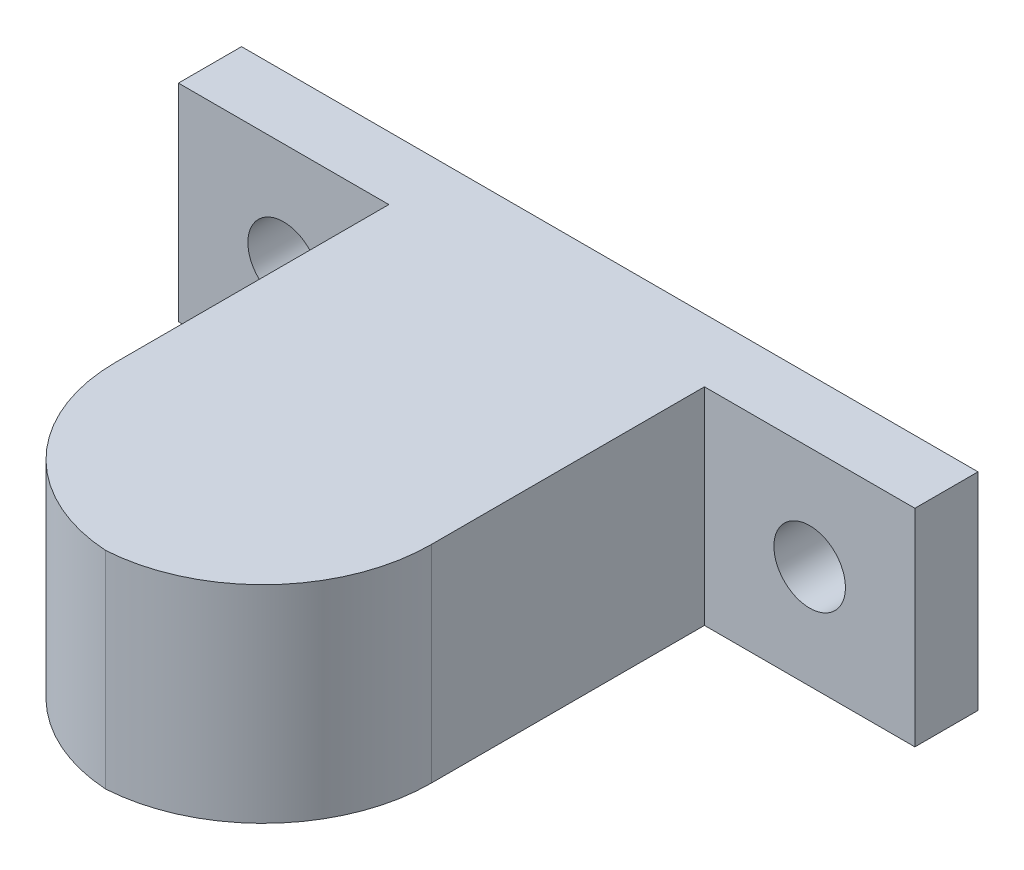
ISO-10303-21;
HEADER;
FILE_DESCRIPTION(('STEP AP214'),'2;1');
FILE_NAME('part.step','',(''),(''),'','','');
FILE_SCHEMA(('AUTOMOTIVE_DESIGN { 1 0 10303 214 1 1 1 1 }'));
ENDSEC;
DATA;
#1=APPLICATION_CONTEXT('core data for automotive mechanical design processes');
#2=APPLICATION_PROTOCOL_DEFINITION('international standard','automotive_design',2000,#1);
#3=PRODUCT_CONTEXT('',#1,'mechanical');
#4=PRODUCT('Part','Part','',(#3));
#5=PRODUCT_RELATED_PRODUCT_CATEGORY('part','',(#4));
#6=PRODUCT_DEFINITION_FORMATION('','',#4);
#7=PRODUCT_DEFINITION_CONTEXT('part definition',#1,'design');
#8=PRODUCT_DEFINITION('design','',#6,#7);
#9=PRODUCT_DEFINITION_SHAPE('','',#8);
#10=(LENGTH_UNIT() NAMED_UNIT(*) SI_UNIT(.MILLI.,.METRE.));
#11=(NAMED_UNIT(*) PLANE_ANGLE_UNIT() SI_UNIT($,.RADIAN.));
#12=(NAMED_UNIT(*) SI_UNIT($,.STERADIAN.) SOLID_ANGLE_UNIT());
#13=UNCERTAINTY_MEASURE_WITH_UNIT(LENGTH_MEASURE(1.E-05),#10,'distance_accuracy_value','');
#14=(GEOMETRIC_REPRESENTATION_CONTEXT(3) GLOBAL_UNCERTAINTY_ASSIGNED_CONTEXT((#13)) GLOBAL_UNIT_ASSIGNED_CONTEXT((#10,
#11,#12)) REPRESENTATION_CONTEXT('',''));
#15=CARTESIAN_POINT('',(0.,0.,0.));
#16=DIRECTION('',(0.,0.,1.));
#17=DIRECTION('',(1.,0.,0.));
#18=AXIS2_PLACEMENT_3D('',#15,#16,#17);
#19=CARTESIAN_POINT('',(0.,0.,3.));
#20=DIRECTION('',(0.,0.,1.));
#21=DIRECTION('',(1.,0.,0.));
#22=AXIS2_PLACEMENT_3D('',#19,#20,#21);
#23=PLANE('',#22);
#24=CARTESIAN_POINT('',(-241.349999999714,299.7113560134,3.));
#25=DIRECTION('',(0.,0.,1.));
#26=DIRECTION('',(1.,0.,0.));
#27=AXIS2_PLACEMENT_3D('',#24,#25,#26);
#28=CIRCLE('',#27,1.70000000000001);
#29=CARTESIAN_POINT('',(-239.649999999714,299.7113560134,3.));
#30=VERTEX_POINT('',#29);
#31=EDGE_CURVE('E163',#30,#30,#28,.T.);
#32=ORIENTED_EDGE('',*,*,#31,.F.);
#33=EDGE_LOOP('',(#32));
#34=FACE_BOUND('',#33,.T.);
#35=DIRECTION('',(1.,0.,0.));
#36=VECTOR('',#35,1.);
#37=CARTESIAN_POINT('',(0.,304.622712026794,3.));
#38=LINE('',#37,#36);
#39=CARTESIAN_POINT('',(-246.349999999708,304.622712026794,3.));
#40=VERTEX_POINT('',#39);
#41=CARTESIAN_POINT('',(-236.349999999714,304.622712026794,3.));
#42=VERTEX_POINT('',#41);
#43=EDGE_CURVE('E125',#40,#42,#38,.T.);
#44=ORIENTED_EDGE('',*,*,#43,.F.);
#45=DIRECTION('',(0.,-1.,0.));
#46=VECTOR('',#45,1.);
#47=CARTESIAN_POINT('',(-246.349999999708,0.,3.));
#48=LINE('',#47,#46);
#49=CARTESIAN_POINT('',(-246.349999999708,294.799999999998,3.));
#50=VERTEX_POINT('',#49);
#51=EDGE_CURVE('E107',#40,#50,#48,.T.);
#52=ORIENTED_EDGE('',*,*,#51,.T.);
#53=DIRECTION('',(1.,0.,0.));
#54=VECTOR('',#53,1.);
#55=CARTESIAN_POINT('',(1.95691328952886E-12,294.799999999996,3.));
#56=LINE('',#55,#54);
#57=CARTESIAN_POINT('',(-236.349999999714,294.799999999998,3.));
#58=VERTEX_POINT('',#57);
#59=EDGE_CURVE('E115',#50,#58,#56,.T.);
#60=ORIENTED_EDGE('',*,*,#59,.T.);
#61=DIRECTION('',(0.,-1.,0.));
#62=VECTOR('',#61,1.);
#63=CARTESIAN_POINT('',(-236.349999999714,0.,3.));
#64=LINE('',#63,#62);
#65=EDGE_CURVE('E170',#42,#58,#64,.T.);
#66=ORIENTED_EDGE('',*,*,#65,.F.);
#67=EDGE_LOOP('',(#44,#52,#60,#66));
#68=FACE_BOUND('',#67,.T.);
#69=ADVANCED_FACE('F34',(#34,#68),#23,.T.);
#70=CARTESIAN_POINT('',(-236.349999999714,0.,3.));
#71=DIRECTION('',(1.,0.,0.));
#72=DIRECTION('',(0.,0.,-1.));
#73=AXIS2_PLACEMENT_3D('',#70,#71,#72);
#74=PLANE('',#73);
#75=DIRECTION('',(0.,-1.,0.));
#76=VECTOR('',#75,1.);
#77=CARTESIAN_POINT('',(-236.349999999714,0.,0.));
#78=LINE('',#77,#76);
#79=CARTESIAN_POINT('',(-236.349999999714,304.622712026794,0.));
#80=VERTEX_POINT('',#79);
#81=CARTESIAN_POINT('',(-236.349999999714,294.799999999998,0.));
#82=VERTEX_POINT('',#81);
#83=EDGE_CURVE('E183',#80,#82,#78,.T.);
#84=ORIENTED_EDGE('',*,*,#83,.F.);
#85=DIRECTION('',(0.,0.,-1.));
#86=VECTOR('',#85,1.);
#87=CARTESIAN_POINT('',(-236.349999999714,304.622712026794,3.));
#88=LINE('',#87,#86);
#89=EDGE_CURVE('E132',#42,#80,#88,.T.);
#90=ORIENTED_EDGE('',*,*,#89,.F.);
#91=ORIENTED_EDGE('',*,*,#65,.T.);
#92=DIRECTION('',(0.,0.,-1.));
#93=VECTOR('',#92,1.);
#94=CARTESIAN_POINT('',(-236.349999999714,294.799999999998,3.));
#95=LINE('',#94,#93);
#96=EDGE_CURVE('E118',#58,#82,#95,.T.);
#97=ORIENTED_EDGE('',*,*,#96,.T.);
#98=EDGE_LOOP('',(#84,#90,#91,#97));
#99=FACE_BOUND('',#98,.T.);
#100=ADVANCED_FACE('F202',(#99),#74,.T.);
#101=CARTESIAN_POINT('',(0.,304.622712026794,3.));
#102=DIRECTION('',(0.,1.,0.));
#103=DIRECTION('',(0.,0.,1.));
#104=AXIS2_PLACEMENT_3D('',#101,#102,#103);
#105=PLANE('',#104);
#106=CARTESIAN_POINT('',(-253.349999999708,304.622712026794,15.9809171334721));
#107=DIRECTION('',(0.,1.,0.));
#108=DIRECTION('',(0.,0.,1.));
#109=AXIS2_PLACEMENT_3D('',#106,#107,#108);
#110=CIRCLE('',#109,8.);
#111=CARTESIAN_POINT('',(-261.349999999708,304.622712026794,15.9809171334721));
#112=VERTEX_POINT('',#111);
#113=CARTESIAN_POINT('',(-253.849999999708,304.622712026794,23.9652768448077));
#114=VERTEX_POINT('',#113);
#115=EDGE_CURVE('E126',#112,#114,#110,.T.);
#116=ORIENTED_EDGE('',*,*,#115,.T.);
#117=CARTESIAN_POINT('',(-254.349999999708,304.622712026794,15.9809171334721));
#118=DIRECTION('',(0.,1.,0.));
#119=DIRECTION('',(0.,0.,1.));
#120=AXIS2_PLACEMENT_3D('',#117,#118,#119);
#121=CIRCLE('',#120,8.);
#122=CARTESIAN_POINT('',(-246.349999999708,304.622712026794,15.9809171334721));
#123=VERTEX_POINT('',#122);
#124=EDGE_CURVE('E129',#114,#123,#121,.T.);
#125=ORIENTED_EDGE('',*,*,#124,.T.);
#126=DIRECTION('',(0.,0.,1.));
#127=VECTOR('',#126,1.);
#128=CARTESIAN_POINT('',(-246.349999999708,304.622712026794,2.83341350286048));
#129=LINE('',#128,#127);
#130=EDGE_CURVE('E142',#40,#123,#129,.T.);
#131=ORIENTED_EDGE('',*,*,#130,.F.);
#132=ORIENTED_EDGE('',*,*,#43,.T.);
#133=ORIENTED_EDGE('',*,*,#89,.T.);
#134=DIRECTION('',(1.,0.,0.));
#135=VECTOR('',#134,1.);
#136=CARTESIAN_POINT('',(0.,304.622712026794,0.));
#137=LINE('',#136,#135);
#138=CARTESIAN_POINT('',(-271.349999999715,304.622712026794,0.));
#139=VERTEX_POINT('',#138);
#140=EDGE_CURVE('E186',#139,#80,#137,.T.);
#141=ORIENTED_EDGE('',*,*,#140,.F.);
#142=DIRECTION('',(0.,0.,-1.));
#143=VECTOR('',#142,1.);
#144=CARTESIAN_POINT('',(-271.349999999715,304.622712026794,3.));
#145=LINE('',#144,#143);
#146=CARTESIAN_POINT('',(-271.349999999715,304.622712026794,3.));
#147=VERTEX_POINT('',#146);
#148=EDGE_CURVE('E197',#147,#139,#145,.T.);
#149=ORIENTED_EDGE('',*,*,#148,.F.);
#150=CARTESIAN_POINT('',(-261.349999999708,304.622712026794,3.));
#151=VERTEX_POINT('',#150);
#152=EDGE_CURVE('E172',#147,#151,#38,.T.);
#153=ORIENTED_EDGE('',*,*,#152,.T.);
#154=DIRECTION('',(0.,0.,1.));
#155=VECTOR('',#154,1.);
#156=CARTESIAN_POINT('',(-261.349999999708,304.622712026794,2.83341350286048));
#157=LINE('',#156,#155);
#158=EDGE_CURVE('E112',#151,#112,#157,.T.);
#159=ORIENTED_EDGE('',*,*,#158,.T.);
#160=EDGE_LOOP('',(#116,#125,#131,#132,#133,#141,#149,#153,#159));
#161=FACE_BOUND('',#160,.T.);
#162=ADVANCED_FACE('F141',(#161),#105,.T.);
#163=CARTESIAN_POINT('',(-271.349999999713,-1.5334818780693E-12,3.));
#164=DIRECTION('',(1.,0.,0.));
#165=DIRECTION('',(0.,1.,0.));
#166=AXIS2_PLACEMENT_3D('',#163,#164,#165);
#167=PLANE('',#166);
#168=DIRECTION('',(0.,-1.,0.));
#169=VECTOR('',#168,1.);
#170=CARTESIAN_POINT('',(-271.349999999713,-1.5334818780693E-12,0.));
#171=LINE('',#170,#169);
#172=CARTESIAN_POINT('',(-271.349999999714,294.799999999998,0.));
#173=VERTEX_POINT('',#172);
#174=EDGE_CURVE('E189',#139,#173,#171,.T.);
#175=ORIENTED_EDGE('',*,*,#174,.T.);
#176=DIRECTION('',(0.,0.,-1.));
#177=VECTOR('',#176,1.);
#178=CARTESIAN_POINT('',(-271.349999999714,294.799999999998,3.));
#179=LINE('',#178,#177);
#180=CARTESIAN_POINT('',(-271.349999999714,294.799999999998,3.));
#181=VERTEX_POINT('',#180);
#182=EDGE_CURVE('E194',#181,#173,#179,.T.);
#183=ORIENTED_EDGE('',*,*,#182,.F.);
#184=DIRECTION('',(0.,-1.,0.));
#185=VECTOR('',#184,1.);
#186=CARTESIAN_POINT('',(-271.349999999713,-1.5334818780693E-12,3.));
#187=LINE('',#186,#185);
#188=EDGE_CURVE('E123',#147,#181,#187,.T.);
#189=ORIENTED_EDGE('',*,*,#188,.F.);
#190=ORIENTED_EDGE('',*,*,#148,.T.);
#191=EDGE_LOOP('',(#175,#183,#189,#190));
#192=FACE_BOUND('',#191,.T.);
#193=ADVANCED_FACE('F208',(#192),#167,.F.);
#194=CARTESIAN_POINT('',(-266.349999999714,299.7113560134,3.));
#195=DIRECTION('',(0.,0.,-1.));
#196=DIRECTION('',(-1.,0.,0.));
#197=AXIS2_PLACEMENT_3D('',#194,#195,#196);
#198=CYLINDRICAL_SURFACE('',#197,1.69999999999995);
#199=CARTESIAN_POINT('',(-266.349999999714,299.7113560134,3.));
#200=DIRECTION('',(0.,0.,1.));
#201=DIRECTION('',(1.,0.,0.));
#202=AXIS2_PLACEMENT_3D('',#199,#200,#201);
#203=CIRCLE('',#202,1.69999999999995);
#204=CARTESIAN_POINT('',(-264.649999999715,299.7113560134,3.));
#205=VERTEX_POINT('',#204);
#206=EDGE_CURVE('E166',#205,#205,#203,.T.);
#207=ORIENTED_EDGE('',*,*,#206,.T.);
#208=EDGE_LOOP('',(#207));
#209=FACE_BOUND('',#208,.T.);
#210=CARTESIAN_POINT('',(-266.349999999714,299.7113560134,0.));
#211=DIRECTION('',(0.,0.,1.));
#212=DIRECTION('',(1.,0.,0.));
#213=AXIS2_PLACEMENT_3D('',#210,#211,#212);
#214=CIRCLE('',#213,1.69999999999995);
#215=CARTESIAN_POINT('',(-264.649999999715,299.7113560134,0.));
#216=VERTEX_POINT('',#215);
#217=EDGE_CURVE('E180',#216,#216,#214,.T.);
#218=ORIENTED_EDGE('',*,*,#217,.F.);
#219=EDGE_LOOP('',(#218));
#220=FACE_BOUND('',#219,.T.);
#221=ADVANCED_FACE('F246',(#209,#220),#198,.F.);
#222=CARTESIAN_POINT('',(-241.349999999714,299.7113560134,3.));
#223=DIRECTION('',(0.,0.,-1.));
#224=DIRECTION('',(-1.,0.,0.));
#225=AXIS2_PLACEMENT_3D('',#222,#223,#224);
#226=CYLINDRICAL_SURFACE('',#225,1.70000000000001);
#227=ORIENTED_EDGE('',*,*,#31,.T.);
#228=EDGE_LOOP('',(#227));
#229=FACE_BOUND('',#228,.T.);
#230=CARTESIAN_POINT('',(-241.349999999714,299.7113560134,0.));
#231=DIRECTION('',(0.,0.,1.));
#232=DIRECTION('',(1.,0.,0.));
#233=AXIS2_PLACEMENT_3D('',#230,#231,#232);
#234=CIRCLE('',#233,1.70000000000001);
#235=CARTESIAN_POINT('',(-239.649999999714,299.7113560134,0.));
#236=VERTEX_POINT('',#235);
#237=EDGE_CURVE('E160',#236,#236,#234,.T.);
#238=ORIENTED_EDGE('',*,*,#237,.F.);
#239=EDGE_LOOP('',(#238));
#240=FACE_BOUND('',#239,.T.);
#241=ADVANCED_FACE('F240',(#229,#240),#226,.F.);
#242=CARTESIAN_POINT('',(1.95691328952886E-12,294.799999999996,3.));
#243=DIRECTION('',(0.,1.,0.));
#244=DIRECTION('',(-1.,0.,0.));
#245=AXIS2_PLACEMENT_3D('',#242,#243,#244);
#246=PLANE('',#245);
#247=CARTESIAN_POINT('',(-253.849999999708,294.799999999998,16.5));
#248=DIRECTION('',(0.,-1.,0.));
#249=DIRECTION('',(1.,0.,0.));
#250=AXIS2_PLACEMENT_3D('',#247,#248,#249);
#251=CIRCLE('',#250,4.10000000000001);
#252=CARTESIAN_POINT('',(-249.749999999708,294.799999999998,16.5));
#253=VERTEX_POINT('',#252);
#254=EDGE_CURVE('E153',#253,#253,#251,.T.);
#255=ORIENTED_EDGE('',*,*,#254,.F.);
#256=EDGE_LOOP('',(#255));
#257=FACE_BOUND('',#256,.T.);
#258=DIRECTION('',(0.,0.,-1.));
#259=VECTOR('',#258,1.);
#260=CARTESIAN_POINT('',(-246.349999999708,294.799999999998,2.83341350286048));
#261=LINE('',#260,#259);
#262=CARTESIAN_POINT('',(-246.349999999708,294.799999999998,15.9809171334721));
#263=VERTEX_POINT('',#262);
#264=EDGE_CURVE('E102',#263,#50,#261,.T.);
#265=ORIENTED_EDGE('',*,*,#264,.F.);
#266=CARTESIAN_POINT('',(-254.349999999708,294.799999999998,15.9809171334721));
#267=DIRECTION('',(0.,1.,0.));
#268=DIRECTION('',(-1.,0.,0.));
#269=AXIS2_PLACEMENT_3D('',#266,#267,#268);
#270=CIRCLE('',#269,8.);
#271=CARTESIAN_POINT('',(-253.849999999708,294.799999999998,23.9652768448077));
#272=VERTEX_POINT('',#271);
#273=EDGE_CURVE('E43',#263,#272,#270,.F.);
#274=ORIENTED_EDGE('',*,*,#273,.T.);
#275=CARTESIAN_POINT('',(-253.349999999708,294.799999999998,15.9809171334721));
#276=DIRECTION('',(0.,1.,0.));
#277=DIRECTION('',(-1.,0.,0.));
#278=AXIS2_PLACEMENT_3D('',#275,#276,#277);
#279=CIRCLE('',#278,8.);
#280=CARTESIAN_POINT('',(-261.349999999708,294.799999999998,15.9809171334721));
#281=VERTEX_POINT('',#280);
#282=EDGE_CURVE('E53',#272,#281,#279,.F.);
#283=ORIENTED_EDGE('',*,*,#282,.T.);
#284=DIRECTION('',(0.,0.,-1.));
#285=VECTOR('',#284,1.);
#286=CARTESIAN_POINT('',(-261.349999999708,294.799999999998,2.83341350286048));
#287=LINE('',#286,#285);
#288=CARTESIAN_POINT('',(-261.349999999708,294.799999999998,3.));
#289=VERTEX_POINT('',#288);
#290=EDGE_CURVE('E111',#281,#289,#287,.T.);
#291=ORIENTED_EDGE('',*,*,#290,.T.);
#292=EDGE_CURVE('E122',#181,#289,#56,.T.);
#293=ORIENTED_EDGE('',*,*,#292,.F.);
#294=ORIENTED_EDGE('',*,*,#182,.T.);
#295=DIRECTION('',(1.,0.,0.));
#296=VECTOR('',#295,1.);
#297=CARTESIAN_POINT('',(1.95691328952886E-12,294.799999999996,0.));
#298=LINE('',#297,#296);
#299=EDGE_CURVE('E167',#173,#82,#298,.T.);
#300=ORIENTED_EDGE('',*,*,#299,.T.);
#301=ORIENTED_EDGE('',*,*,#96,.F.);
#302=ORIENTED_EDGE('',*,*,#59,.F.);
#303=EDGE_LOOP('',(#265,#274,#283,#291,#293,#294,#300,#301,#302));
#304=FACE_BOUND('',#303,.T.);
#305=ADVANCED_FACE('F116',(#257,#304),#246,.F.);
#306=DIRECTION('',(0.,-1.,0.));
#307=VECTOR('',#306,1.);
#308=CARTESIAN_POINT('',(-261.349999999708,0.,3.));
#309=LINE('',#308,#307);
#310=EDGE_CURVE('E127',#151,#289,#309,.T.);
#311=ORIENTED_EDGE('',*,*,#310,.F.);
#312=ORIENTED_EDGE('',*,*,#152,.F.);
#313=ORIENTED_EDGE('',*,*,#188,.T.);
#314=ORIENTED_EDGE('',*,*,#292,.T.);
#315=EDGE_LOOP('',(#311,#312,#313,#314));
#316=FACE_BOUND('',#315,.T.);
#317=ORIENTED_EDGE('',*,*,#206,.F.);
#318=EDGE_LOOP('',(#317));
#319=FACE_BOUND('',#318,.T.);
#320=ADVANCED_FACE('F226',(#316,#319),#23,.T.);
#321=CARTESIAN_POINT('',(0.,0.,0.));
#322=DIRECTION('',(0.,0.,1.));
#323=DIRECTION('',(1.,0.,0.));
#324=AXIS2_PLACEMENT_3D('',#321,#322,#323);
#325=PLANE('',#324);
#326=ORIENTED_EDGE('',*,*,#237,.T.);
#327=EDGE_LOOP('',(#326));
#328=FACE_BOUND('',#327,.T.);
#329=ORIENTED_EDGE('',*,*,#217,.T.);
#330=EDGE_LOOP('',(#329));
#331=FACE_BOUND('',#330,.T.);
#332=ORIENTED_EDGE('',*,*,#83,.T.);
#333=ORIENTED_EDGE('',*,*,#299,.F.);
#334=ORIENTED_EDGE('',*,*,#174,.F.);
#335=ORIENTED_EDGE('',*,*,#140,.T.);
#336=EDGE_LOOP('',(#332,#333,#334,#335));
#337=FACE_BOUND('',#336,.T.);
#338=ADVANCED_FACE('F205',(#328,#331,#337),#325,.F.);
#339=CARTESIAN_POINT('',(-246.349999999708,268.872853805194,2.83341350286048));
#340=DIRECTION('',(-1.,0.,0.));
#341=DIRECTION('',(0.,0.,1.));
#342=AXIS2_PLACEMENT_3D('',#339,#340,#341);
#343=PLANE('',#342);
#344=ORIENTED_EDGE('',*,*,#130,.T.);
#345=DIRECTION('',(0.,1.,0.));
#346=VECTOR('',#345,1.);
#347=CARTESIAN_POINT('',(-246.349999999708,294.799999999998,15.9809171334721));
#348=LINE('',#347,#346);
#349=EDGE_CURVE('E110',#123,#263,#348,.F.);
#350=ORIENTED_EDGE('',*,*,#349,.T.);
#351=ORIENTED_EDGE('',*,*,#264,.T.);
#352=ORIENTED_EDGE('',*,*,#51,.F.);
#353=EDGE_LOOP('',(#344,#350,#351,#352));
#354=FACE_BOUND('',#353,.T.);
#355=ADVANCED_FACE('F105',(#354),#343,.F.);
#356=CARTESIAN_POINT('',(-261.349999999708,268.872853805194,2.83341350286048));
#357=DIRECTION('',(-1.,0.,0.));
#358=DIRECTION('',(0.,0.,1.));
#359=AXIS2_PLACEMENT_3D('',#356,#357,#358);
#360=PLANE('',#359);
#361=ORIENTED_EDGE('',*,*,#290,.F.);
#362=DIRECTION('',(0.,1.,0.));
#363=VECTOR('',#362,1.);
#364=CARTESIAN_POINT('',(-261.349999999708,268.872853805194,15.9809171334721));
#365=LINE('',#364,#363);
#366=EDGE_CURVE('E11',#281,#112,#365,.T.);
#367=ORIENTED_EDGE('',*,*,#366,.T.);
#368=ORIENTED_EDGE('',*,*,#158,.F.);
#369=ORIENTED_EDGE('',*,*,#310,.T.);
#370=EDGE_LOOP('',(#361,#367,#368,#369));
#371=FACE_BOUND('',#370,.T.);
#372=ADVANCED_FACE('F214',(#371),#360,.T.);
#373=CARTESIAN_POINT('',(-253.349999999708,268.872853805194,15.9809171334721));
#374=DIRECTION('',(0.,1.,0.));
#375=DIRECTION('',(0.,0.,1.));
#376=AXIS2_PLACEMENT_3D('',#373,#374,#375);
#377=CYLINDRICAL_SURFACE('',#376,8.);
#378=ORIENTED_EDGE('',*,*,#366,.F.);
#379=ORIENTED_EDGE('',*,*,#282,.F.);
#380=DIRECTION('',(0.,1.,0.));
#381=VECTOR('',#380,1.);
#382=CARTESIAN_POINT('',(-253.849999999708,299.711356013396,23.9652768448077));
#383=LINE('',#382,#381);
#384=EDGE_CURVE('E38',#114,#272,#383,.F.);
#385=ORIENTED_EDGE('',*,*,#384,.F.);
#386=ORIENTED_EDGE('',*,*,#115,.F.);
#387=EDGE_LOOP('',(#378,#379,#385,#386));
#388=FACE_BOUND('',#387,.T.);
#389=ADVANCED_FACE('F36',(#388),#377,.T.);
#390=CARTESIAN_POINT('',(-254.349999999708,268.872853805194,15.9809171334721));
#391=DIRECTION('',(0.,-1.,0.));
#392=DIRECTION('',(0.,0.,-1.));
#393=AXIS2_PLACEMENT_3D('',#390,#391,#392);
#394=CYLINDRICAL_SURFACE('',#393,8.);
#395=ORIENTED_EDGE('',*,*,#273,.F.);
#396=ORIENTED_EDGE('',*,*,#349,.F.);
#397=ORIENTED_EDGE('',*,*,#124,.F.);
#398=ORIENTED_EDGE('',*,*,#384,.T.);
#399=EDGE_LOOP('',(#395,#396,#397,#398));
#400=FACE_BOUND('',#399,.T.);
#401=ADVANCED_FACE('F149',(#400),#394,.T.);
#402=CARTESIAN_POINT('',(-50.9499999997786,301.999999999983,16.5));
#403=DIRECTION('',(0.,1.,0.));
#404=DIRECTION('',(0.,0.,-1.));
#405=AXIS2_PLACEMENT_3D('',#402,#403,#404);
#406=PLANE('',#405);
#407=CARTESIAN_POINT('',(-253.849999999708,301.999999999983,16.5));
#408=DIRECTION('',(0.,1.,0.));
#409=DIRECTION('',(0.,0.,1.));
#410=AXIS2_PLACEMENT_3D('',#407,#408,#409);
#411=CIRCLE('',#410,4.10000000000001);
#412=CARTESIAN_POINT('',(-253.849999999708,301.999999999983,20.6));
#413=VERTEX_POINT('',#412);
#414=EDGE_CURVE('E151',#413,#413,#411,.F.);
#415=ORIENTED_EDGE('',*,*,#414,.T.);
#416=EDGE_LOOP('',(#415));
#417=FACE_BOUND('',#416,.T.);
#418=ADVANCED_FACE('F221',(#417),#406,.F.);
#419=CARTESIAN_POINT('',(-253.849999999708,313.596551211443,16.5));
#420=DIRECTION('',(0.,-1.,0.));
#421=DIRECTION('',(1.,0.,0.));
#422=AXIS2_PLACEMENT_3D('',#419,#420,#421);
#423=CYLINDRICAL_SURFACE('',#422,4.10000000000001);
#424=ORIENTED_EDGE('',*,*,#254,.T.);
#425=EDGE_LOOP('',(#424));
#426=FACE_BOUND('',#425,.T.);
#427=ORIENTED_EDGE('',*,*,#414,.F.);
#428=EDGE_LOOP('',(#427));
#429=FACE_BOUND('',#428,.T.);
#430=ADVANCED_FACE('F353',(#426,#429),#423,.F.);
#431=CLOSED_SHELL('',(#69,#100,#162,#193,#221,#241,#305,#320,#338,#355,#372,#389,#401,#418,#430));
#432=MANIFOLD_SOLID_BREP('B2',#431);
#433=ADVANCED_BREP_SHAPE_REPRESENTATION('',(#18,#432),#14);
#434=SHAPE_DEFINITION_REPRESENTATION(#9,#433);
ENDSEC;
END-ISO-10303-21;
